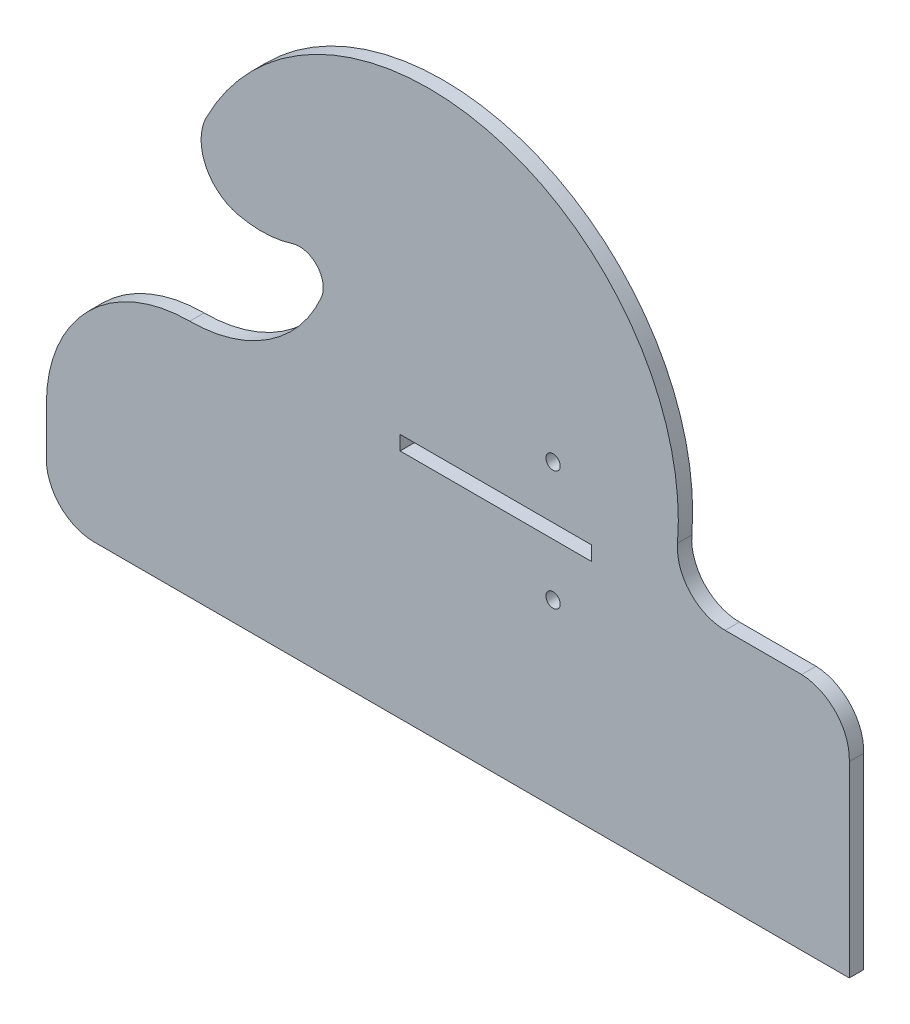
ISO-10303-21;
HEADER;
FILE_DESCRIPTION(('STEP AP214'),'2;1');
FILE_NAME('part.step','',(''),(''),'','','');
FILE_SCHEMA(('AUTOMOTIVE_DESIGN { 1 0 10303 214 1 1 1 1 }'));
ENDSEC;
DATA;
#1=APPLICATION_CONTEXT('core data for automotive mechanical design processes');
#2=APPLICATION_PROTOCOL_DEFINITION('international standard','automotive_design',2000,#1);
#3=PRODUCT_CONTEXT('',#1,'mechanical');
#4=PRODUCT('Part','Part','',(#3));
#5=PRODUCT_RELATED_PRODUCT_CATEGORY('part','',(#4));
#6=PRODUCT_DEFINITION_FORMATION('','',#4);
#7=PRODUCT_DEFINITION_CONTEXT('part definition',#1,'design');
#8=PRODUCT_DEFINITION('design','',#6,#7);
#9=PRODUCT_DEFINITION_SHAPE('','',#8);
#10=(LENGTH_UNIT() NAMED_UNIT(*) SI_UNIT(.MILLI.,.METRE.));
#11=(NAMED_UNIT(*) PLANE_ANGLE_UNIT() SI_UNIT($,.RADIAN.));
#12=(NAMED_UNIT(*) SI_UNIT($,.STERADIAN.) SOLID_ANGLE_UNIT());
#13=UNCERTAINTY_MEASURE_WITH_UNIT(LENGTH_MEASURE(1.E-05),#10,'distance_accuracy_value','');
#14=(GEOMETRIC_REPRESENTATION_CONTEXT(3) GLOBAL_UNCERTAINTY_ASSIGNED_CONTEXT((#13)) GLOBAL_UNIT_ASSIGNED_CONTEXT((#10,
#11,#12)) REPRESENTATION_CONTEXT('',''));
#15=CARTESIAN_POINT('',(0.,0.,0.));
#16=DIRECTION('',(0.,0.,1.));
#17=DIRECTION('',(1.,0.,0.));
#18=AXIS2_PLACEMENT_3D('',#15,#16,#17);
#19=CARTESIAN_POINT('',(-3.69672250453785,-39.0229332465025,3.));
#20=DIRECTION('',(0.,0.,-1.));
#21=DIRECTION('',(-1.,0.,0.));
#22=AXIS2_PLACEMENT_3D('',#19,#20,#21);
#23=CYLINDRICAL_SURFACE('',#22,30.);
#24=CARTESIAN_POINT('',(-3.69672250453785,-39.0229332465025,0.));
#25=DIRECTION('',(0.,0.,1.));
#26=DIRECTION('',(1.,0.,0.));
#27=AXIS2_PLACEMENT_3D('',#24,#25,#26);
#28=CIRCLE('',#27,30.);
#29=CARTESIAN_POINT('',(-3.69672250453788,-9.02293324650248,0.));
#30=VERTEX_POINT('',#29);
#31=CARTESIAN_POINT('',(-33.6967225045379,-39.0229332465025,0.));
#32=VERTEX_POINT('',#31);
#33=EDGE_CURVE('E194',#30,#32,#28,.T.);
#34=ORIENTED_EDGE('',*,*,#33,.T.);
#35=DIRECTION('',(0.,0.,-1.));
#36=VECTOR('',#35,1.);
#37=CARTESIAN_POINT('',(-33.6967225045379,-39.0229332465025,3.));
#38=LINE('',#37,#36);
#39=CARTESIAN_POINT('',(-33.6967225045379,-39.0229332465025,3.));
#40=VERTEX_POINT('',#39);
#41=EDGE_CURVE('E11',#40,#32,#38,.T.);
#42=ORIENTED_EDGE('',*,*,#41,.F.);
#43=CARTESIAN_POINT('',(-3.69672250453785,-39.0229332465025,3.));
#44=DIRECTION('',(0.,0.,1.));
#45=DIRECTION('',(1.,0.,0.));
#46=AXIS2_PLACEMENT_3D('',#43,#44,#45);
#47=CIRCLE('',#46,30.);
#48=CARTESIAN_POINT('',(-3.69672250453788,-9.02293324650248,3.));
#49=VERTEX_POINT('',#48);
#50=EDGE_CURVE('E198',#49,#40,#47,.T.);
#51=ORIENTED_EDGE('',*,*,#50,.F.);
#52=DIRECTION('',(0.,0.,-1.));
#53=VECTOR('',#52,1.);
#54=CARTESIAN_POINT('',(-3.69672250453788,-9.02293324650248,3.));
#55=LINE('',#54,#53);
#56=EDGE_CURVE('E228',#49,#30,#55,.T.);
#57=ORIENTED_EDGE('',*,*,#56,.T.);
#58=EDGE_LOOP('',(#34,#42,#51,#57));
#59=FACE_BOUND('',#58,.T.);
#60=ADVANCED_FACE('F33',(#59),#23,.T.);
#61=CARTESIAN_POINT('',(-33.6967225045379,-39.0229332465025,3.));
#62=DIRECTION('',(0.999999999834086,1.82161160664153E-05,0.));
#63=DIRECTION('',(-1.82161160664153E-05,0.999999999834087,0.));
#64=AXIS2_PLACEMENT_3D('',#61,#62,#63);
#65=PLANE('',#64);
#66=DIRECTION('',(1.82161160664153E-05,-0.999999999834086,0.));
#67=VECTOR('',#66,1.);
#68=CARTESIAN_POINT('',(-33.6967225045379,-39.0229332465025,0.));
#69=LINE('',#68,#67);
#70=CARTESIAN_POINT('',(-33.6965402836484,-49.0262121460669,0.));
#71=VERTEX_POINT('',#70);
#72=EDGE_CURVE('E231',#32,#71,#69,.T.);
#73=ORIENTED_EDGE('',*,*,#72,.T.);
#74=DIRECTION('',(0.,0.,-1.));
#75=VECTOR('',#74,1.);
#76=CARTESIAN_POINT('',(-33.6965402836484,-49.0262121460669,3.));
#77=LINE('',#76,#75);
#78=CARTESIAN_POINT('',(-33.6965402836484,-49.0262121460669,3.));
#79=VERTEX_POINT('',#78);
#80=EDGE_CURVE('E40',#79,#71,#77,.T.);
#81=ORIENTED_EDGE('',*,*,#80,.F.);
#82=DIRECTION('',(1.82161160664153E-05,-0.999999999834086,0.));
#83=VECTOR('',#82,1.);
#84=CARTESIAN_POINT('',(-33.6967225045379,-39.0229332465025,3.));
#85=LINE('',#84,#83);
#86=EDGE_CURVE('E201',#40,#79,#85,.T.);
#87=ORIENTED_EDGE('',*,*,#86,.F.);
#88=ORIENTED_EDGE('',*,*,#41,.T.);
#89=EDGE_LOOP('',(#73,#81,#87,#88));
#90=FACE_BOUND('',#89,.T.);
#91=ADVANCED_FACE('F316',(#90),#65,.F.);
#92=CARTESIAN_POINT('',(-23.6965402853075,-49.0260299849063,3.));
#93=DIRECTION('',(0.,0.,-1.));
#94=DIRECTION('',(-1.,0.,0.));
#95=AXIS2_PLACEMENT_3D('',#92,#93,#94);
#96=CYLINDRICAL_SURFACE('',#95,10.);
#97=CARTESIAN_POINT('',(-23.6965402853075,-49.0260299849063,0.));
#98=DIRECTION('',(0.,0.,1.));
#99=DIRECTION('',(-1.,0.,0.));
#100=AXIS2_PLACEMENT_3D('',#97,#98,#99);
#101=CIRCLE('',#100,10.);
#102=CARTESIAN_POINT('',(-23.6965402853074,-59.0260299849063,0.));
#103=VERTEX_POINT('',#102);
#104=EDGE_CURVE('E233',#71,#103,#101,.T.);
#105=ORIENTED_EDGE('',*,*,#104,.T.);
#106=DIRECTION('',(0.,0.,-1.));
#107=VECTOR('',#106,1.);
#108=CARTESIAN_POINT('',(-23.6965402853074,-59.0260299849063,3.));
#109=LINE('',#108,#107);
#110=CARTESIAN_POINT('',(-23.6965402853074,-59.0260299849063,3.));
#111=VERTEX_POINT('',#110);
#112=EDGE_CURVE('E288',#111,#103,#109,.T.);
#113=ORIENTED_EDGE('',*,*,#112,.F.);
#114=CARTESIAN_POINT('',(-23.6965402853075,-49.0260299849063,3.));
#115=DIRECTION('',(0.,0.,1.));
#116=DIRECTION('',(-1.,0.,0.));
#117=AXIS2_PLACEMENT_3D('',#114,#115,#116);
#118=CIRCLE('',#117,10.);
#119=EDGE_CURVE('E204',#79,#111,#118,.T.);
#120=ORIENTED_EDGE('',*,*,#119,.F.);
#121=ORIENTED_EDGE('',*,*,#80,.T.);
#122=EDGE_LOOP('',(#105,#113,#120,#121));
#123=FACE_BOUND('',#122,.T.);
#124=ADVANCED_FACE('F295',(#123),#96,.T.);
#125=CARTESIAN_POINT('',(-23.6965402853074,-59.0260299849063,3.));
#126=DIRECTION('',(0.,1.,0.));
#127=DIRECTION('',(0.,0.,1.));
#128=AXIS2_PLACEMENT_3D('',#125,#126,#127);
#129=PLANE('',#128);
#130=DIRECTION('',(1.,0.,0.));
#131=VECTOR('',#130,1.);
#132=CARTESIAN_POINT('',(-23.6965402853074,-59.0260299849063,0.));
#133=LINE('',#132,#131);
#134=CARTESIAN_POINT('',(126.303641817783,-59.0260299849063,0.));
#135=VERTEX_POINT('',#134);
#136=EDGE_CURVE('E235',#103,#135,#133,.T.);
#137=ORIENTED_EDGE('',*,*,#136,.T.);
#138=DIRECTION('',(0.,0.,-1.));
#139=VECTOR('',#138,1.);
#140=CARTESIAN_POINT('',(126.303641817783,-59.0260299849063,3.));
#141=LINE('',#140,#139);
#142=CARTESIAN_POINT('',(126.303641817783,-59.0260299849063,3.));
#143=VERTEX_POINT('',#142);
#144=EDGE_CURVE('E285',#143,#135,#141,.T.);
#145=ORIENTED_EDGE('',*,*,#144,.F.);
#146=DIRECTION('',(1.,0.,0.));
#147=VECTOR('',#146,1.);
#148=CARTESIAN_POINT('',(-23.6965402853074,-59.0260299849063,3.));
#149=LINE('',#148,#147);
#150=EDGE_CURVE('E206',#111,#143,#149,.T.);
#151=ORIENTED_EDGE('',*,*,#150,.F.);
#152=ORIENTED_EDGE('',*,*,#112,.T.);
#153=EDGE_LOOP('',(#137,#145,#151,#152));
#154=FACE_BOUND('',#153,.T.);
#155=ADVANCED_FACE('F304',(#154),#129,.F.);
#156=CARTESIAN_POINT('',(134.271164489575,-59.0229332451747,3.));
#157=DIRECTION('',(-0.000388670308860665,0.999999924467692,0.));
#158=DIRECTION('',(-0.999999924467693,-0.000388670308860665,0.));
#159=AXIS2_PLACEMENT_3D('',#156,#157,#158);
#160=PLANE('',#159);
#161=DIRECTION('',(0.999999924467693,0.000388670308860665,0.));
#162=VECTOR('',#161,1.);
#163=CARTESIAN_POINT('',(134.271164489575,-59.0229332451747,0.));
#164=LINE('',#163,#162);
#165=CARTESIAN_POINT('',(134.271164489575,-59.0229332451747,0.));
#166=VERTEX_POINT('',#165);
#167=EDGE_CURVE('E237',#135,#166,#164,.T.);
#168=ORIENTED_EDGE('',*,*,#167,.T.);
#169=DIRECTION('',(0.,0.,-1.));
#170=VECTOR('',#169,1.);
#171=CARTESIAN_POINT('',(134.271164489575,-59.0229332451747,3.));
#172=LINE('',#171,#170);
#173=CARTESIAN_POINT('',(134.271164489575,-59.0229332451747,3.));
#174=VERTEX_POINT('',#173);
#175=EDGE_CURVE('E282',#174,#166,#172,.T.);
#176=ORIENTED_EDGE('',*,*,#175,.F.);
#177=DIRECTION('',(0.999999924467693,0.000388670308860665,0.));
#178=VECTOR('',#177,1.);
#179=CARTESIAN_POINT('',(134.271164489575,-59.0229332451747,3.));
#180=LINE('',#179,#178);
#181=EDGE_CURVE('E208',#143,#174,#180,.T.);
#182=ORIENTED_EDGE('',*,*,#181,.F.);
#183=ORIENTED_EDGE('',*,*,#144,.T.);
#184=EDGE_LOOP('',(#168,#176,#182,#183));
#185=FACE_BOUND('',#184,.T.);
#186=ADVANCED_FACE('F308',(#185),#160,.F.);
#187=CARTESIAN_POINT('',(134.271164489575,-19.8229332465025,3.));
#188=DIRECTION('',(-1.,0.,0.));
#189=DIRECTION('',(0.,0.,1.));
#190=AXIS2_PLACEMENT_3D('',#187,#188,#189);
#191=PLANE('',#190);
#192=DIRECTION('',(0.,1.,0.));
#193=VECTOR('',#192,1.);
#194=CARTESIAN_POINT('',(134.271164489575,-19.8229332465025,0.));
#195=LINE('',#194,#193);
#196=CARTESIAN_POINT('',(134.271164489575,-19.8229332465025,0.));
#197=VERTEX_POINT('',#196);
#198=EDGE_CURVE('E239',#166,#197,#195,.T.);
#199=ORIENTED_EDGE('',*,*,#198,.T.);
#200=DIRECTION('',(0.,0.,-1.));
#201=VECTOR('',#200,1.);
#202=CARTESIAN_POINT('',(134.271164489575,-19.8229332465025,3.));
#203=LINE('',#202,#201);
#204=CARTESIAN_POINT('',(134.271164489575,-19.8229332465025,3.));
#205=VERTEX_POINT('',#204);
#206=EDGE_CURVE('E279',#205,#197,#203,.T.);
#207=ORIENTED_EDGE('',*,*,#206,.F.);
#208=DIRECTION('',(0.,1.,0.));
#209=VECTOR('',#208,1.);
#210=CARTESIAN_POINT('',(134.271164489575,-19.8229332465025,3.));
#211=LINE('',#210,#209);
#212=EDGE_CURVE('E210',#174,#205,#211,.T.);
#213=ORIENTED_EDGE('',*,*,#212,.F.);
#214=ORIENTED_EDGE('',*,*,#175,.T.);
#215=EDGE_LOOP('',(#199,#207,#213,#214));
#216=FACE_BOUND('',#215,.T.);
#217=ADVANCED_FACE('F359',(#216),#191,.F.);
#218=CARTESIAN_POINT('',(123.886168263713,-19.4078388128588,3.));
#219=DIRECTION('',(0.,0.,-1.));
#220=DIRECTION('',(-1.,0.,0.));
#221=AXIS2_PLACEMENT_3D('',#218,#219,#220);
#222=CYLINDRICAL_SURFACE('',#221,10.3932886999255);
#223=CARTESIAN_POINT('',(123.886168263713,-19.4078388128588,0.));
#224=DIRECTION('',(0.,0.,1.));
#225=DIRECTION('',(-1.,0.,0.));
#226=AXIS2_PLACEMENT_3D('',#223,#224,#225);
#227=CIRCLE('',#226,10.3932886999255);
#228=CARTESIAN_POINT('',(124.303524679575,-9.02293324650249,0.));
#229=VERTEX_POINT('',#228);
#230=EDGE_CURVE('E241',#197,#229,#227,.T.);
#231=ORIENTED_EDGE('',*,*,#230,.T.);
#232=DIRECTION('',(0.,0.,-1.));
#233=VECTOR('',#232,1.);
#234=CARTESIAN_POINT('',(124.303524679575,-9.02293324650249,3.));
#235=LINE('',#234,#233);
#236=CARTESIAN_POINT('',(124.303524679575,-9.02293324650249,3.));
#237=VERTEX_POINT('',#236);
#238=EDGE_CURVE('E276',#237,#229,#235,.T.);
#239=ORIENTED_EDGE('',*,*,#238,.F.);
#240=CARTESIAN_POINT('',(123.886168263713,-19.4078388128588,3.));
#241=DIRECTION('',(0.,0.,1.));
#242=DIRECTION('',(-1.,0.,0.));
#243=AXIS2_PLACEMENT_3D('',#240,#241,#242);
#244=CIRCLE('',#243,10.3932886999255);
#245=EDGE_CURVE('E212',#205,#237,#244,.T.);
#246=ORIENTED_EDGE('',*,*,#245,.F.);
#247=ORIENTED_EDGE('',*,*,#206,.T.);
#248=EDGE_LOOP('',(#231,#239,#246,#247));
#249=FACE_BOUND('',#248,.T.);
#250=ADVANCED_FACE('F357',(#249),#222,.T.);
#251=CARTESIAN_POINT('',(108.303524679575,-9.0229332465025,3.));
#252=DIRECTION('',(0.,-1.,0.));
#253=DIRECTION('',(1.,0.,0.));
#254=AXIS2_PLACEMENT_3D('',#251,#252,#253);
#255=PLANE('',#254);
#256=DIRECTION('',(-1.,0.,0.));
#257=VECTOR('',#256,1.);
#258=CARTESIAN_POINT('',(108.303524679575,-9.0229332465025,0.));
#259=LINE('',#258,#257);
#260=CARTESIAN_POINT('',(108.303524679575,-9.02293324650249,0.));
#261=VERTEX_POINT('',#260);
#262=EDGE_CURVE('E243',#229,#261,#259,.T.);
#263=ORIENTED_EDGE('',*,*,#262,.T.);
#264=DIRECTION('',(0.,0.,-1.));
#265=VECTOR('',#264,1.);
#266=CARTESIAN_POINT('',(108.303524679575,-9.02293324650249,3.));
#267=LINE('',#266,#265);
#268=CARTESIAN_POINT('',(108.303524679575,-9.02293324650249,3.));
#269=VERTEX_POINT('',#268);
#270=EDGE_CURVE('E273',#269,#261,#267,.T.);
#271=ORIENTED_EDGE('',*,*,#270,.F.);
#272=DIRECTION('',(-1.,0.,0.));
#273=VECTOR('',#272,1.);
#274=CARTESIAN_POINT('',(108.303524679575,-9.0229332465025,3.));
#275=LINE('',#274,#273);
#276=EDGE_CURVE('E214',#237,#269,#275,.T.);
#277=ORIENTED_EDGE('',*,*,#276,.F.);
#278=ORIENTED_EDGE('',*,*,#238,.T.);
#279=EDGE_LOOP('',(#263,#271,#277,#278));
#280=FACE_BOUND('',#279,.T.);
#281=ADVANCED_FACE('F352',(#280),#255,.F.);
#282=CARTESIAN_POINT('',(108.303524679575,0.977066753497506,3.));
#283=DIRECTION('',(0.,0.,-1.));
#284=DIRECTION('',(-1.,0.,0.));
#285=AXIS2_PLACEMENT_3D('',#282,#283,#284);
#286=CYLINDRICAL_SURFACE('',#285,10.);
#287=CARTESIAN_POINT('',(108.303524679575,0.977066753497506,0.));
#288=DIRECTION('',(0.,0.,-1.));
#289=DIRECTION('',(-1.,0.,0.));
#290=AXIS2_PLACEMENT_3D('',#287,#288,#289);
#291=CIRCLE('',#290,10.);
#292=CARTESIAN_POINT('',(98.335884872677,1.78090546863187,0.));
#293=VERTEX_POINT('',#292);
#294=EDGE_CURVE('E245',#261,#293,#291,.T.);
#295=ORIENTED_EDGE('',*,*,#294,.T.);
#296=DIRECTION('',(0.,0.,-1.));
#297=VECTOR('',#296,1.);
#298=CARTESIAN_POINT('',(98.335884872677,1.78090546863187,3.));
#299=LINE('',#298,#297);
#300=CARTESIAN_POINT('',(98.335884872677,1.78090546863187,3.));
#301=VERTEX_POINT('',#300);
#302=EDGE_CURVE('E270',#301,#293,#299,.T.);
#303=ORIENTED_EDGE('',*,*,#302,.F.);
#304=CARTESIAN_POINT('',(108.303524679575,0.977066753497506,3.));
#305=DIRECTION('',(0.,0.,-1.));
#306=DIRECTION('',(-1.,0.,0.));
#307=AXIS2_PLACEMENT_3D('',#304,#305,#306);
#308=CIRCLE('',#307,10.);
#309=EDGE_CURVE('E216',#269,#301,#308,.T.);
#310=ORIENTED_EDGE('',*,*,#309,.F.);
#311=ORIENTED_EDGE('',*,*,#270,.T.);
#312=EDGE_LOOP('',(#295,#303,#310,#311));
#313=FACE_BOUND('',#312,.T.);
#314=ADVANCED_FACE('F347',(#313),#286,.F.);
#315=CARTESIAN_POINT('',(46.3032774954621,5.97706675349758,3.));
#316=DIRECTION('',(0.,0.,-1.));
#317=DIRECTION('',(-1.,0.,0.));
#318=AXIS2_PLACEMENT_3D('',#315,#316,#317);
#319=CYLINDRICAL_SURFACE('',#318,52.2015325445528);
#320=CARTESIAN_POINT('',(46.3032774954621,5.97706675349758,0.));
#321=DIRECTION('',(0.,0.,1.));
#322=DIRECTION('',(-1.,0.,0.));
#323=AXIS2_PLACEMENT_3D('',#320,#321,#322);
#324=CIRCLE('',#323,52.2015325445528);
#325=CARTESIAN_POINT('',(-0.245391501906007,29.603776523871,0.));
#326=VERTEX_POINT('',#325);
#327=EDGE_CURVE('E247',#293,#326,#324,.T.);
#328=ORIENTED_EDGE('',*,*,#327,.T.);
#329=DIRECTION('',(0.,0.,-1.));
#330=VECTOR('',#329,1.);
#331=CARTESIAN_POINT('',(-0.245391501906007,29.603776523871,3.));
#332=LINE('',#331,#330);
#333=CARTESIAN_POINT('',(-0.245391501906007,29.603776523871,3.));
#334=VERTEX_POINT('',#333);
#335=EDGE_CURVE('E267',#334,#326,#332,.T.);
#336=ORIENTED_EDGE('',*,*,#335,.F.);
#337=CARTESIAN_POINT('',(46.3032774954621,5.97706675349758,3.));
#338=DIRECTION('',(0.,0.,1.));
#339=DIRECTION('',(-1.,0.,0.));
#340=AXIS2_PLACEMENT_3D('',#337,#338,#339);
#341=CIRCLE('',#340,52.2015325445528);
#342=EDGE_CURVE('E218',#301,#334,#341,.T.);
#343=ORIENTED_EDGE('',*,*,#342,.F.);
#344=ORIENTED_EDGE('',*,*,#302,.T.);
#345=EDGE_LOOP('',(#328,#336,#343,#344));
#346=FACE_BOUND('',#345,.T.);
#347=ADVANCED_FACE('F343',(#346),#319,.T.);
#348=CARTESIAN_POINT('',(8.67171623964163,25.0777197936,3.));
#349=DIRECTION('',(0.,0.,-1.));
#350=DIRECTION('',(-1.,0.,0.));
#351=AXIS2_PLACEMENT_3D('',#348,#349,#350);
#352=CYLINDRICAL_SURFACE('',#351,10.);
#353=CARTESIAN_POINT('',(8.67171623964163,25.0777197936,0.));
#354=DIRECTION('',(0.,0.,1.));
#355=DIRECTION('',(1.,0.,0.));
#356=AXIS2_PLACEMENT_3D('',#353,#354,#355);
#357=CIRCLE('',#356,10.);
#358=CARTESIAN_POINT('',(6.32530271980205,15.3568996844778,0.));
#359=VERTEX_POINT('',#358);
#360=EDGE_CURVE('E249',#326,#359,#357,.T.);
#361=ORIENTED_EDGE('',*,*,#360,.T.);
#362=DIRECTION('',(0.,0.,-1.));
#363=VECTOR('',#362,1.);
#364=CARTESIAN_POINT('',(6.32530271980205,15.3568996844778,3.));
#365=LINE('',#364,#363);
#366=CARTESIAN_POINT('',(6.32530271980205,15.3568996844778,3.));
#367=VERTEX_POINT('',#366);
#368=EDGE_CURVE('E264',#367,#359,#365,.T.);
#369=ORIENTED_EDGE('',*,*,#368,.F.);
#370=CARTESIAN_POINT('',(8.67171623964163,25.0777197936,3.));
#371=DIRECTION('',(0.,0.,1.));
#372=DIRECTION('',(1.,0.,0.));
#373=AXIS2_PLACEMENT_3D('',#370,#371,#372);
#374=CIRCLE('',#373,10.);
#375=EDGE_CURVE('E220',#334,#367,#374,.T.);
#376=ORIENTED_EDGE('',*,*,#375,.F.);
#377=ORIENTED_EDGE('',*,*,#335,.T.);
#378=EDGE_LOOP('',(#361,#369,#376,#377));
#379=FACE_BOUND('',#378,.T.);
#380=ADVANCED_FACE('F338',(#379),#352,.T.);
#381=CARTESIAN_POINT('',(11.3031666132172,35.9794025069521,3.));
#382=DIRECTION('',(0.,0.,-1.));
#383=DIRECTION('',(-1.,0.,0.));
#384=AXIS2_PLACEMENT_3D('',#381,#382,#383);
#385=CYLINDRICAL_SURFACE('',#384,21.2147767276567);
#386=CARTESIAN_POINT('',(11.3031666132172,35.9794025069521,0.));
#387=DIRECTION('',(0.,0.,1.));
#388=DIRECTION('',(1.,0.,0.));
#389=AXIS2_PLACEMENT_3D('',#386,#387,#388);
#390=CIRCLE('',#389,21.2147767276567);
#391=CARTESIAN_POINT('',(17.7111350484634,15.7555380855016,0.));
#392=VERTEX_POINT('',#391);
#393=EDGE_CURVE('E251',#359,#392,#390,.T.);
#394=ORIENTED_EDGE('',*,*,#393,.T.);
#395=DIRECTION('',(0.,0.,-1.));
#396=VECTOR('',#395,1.);
#397=CARTESIAN_POINT('',(17.7111350484634,15.7555380855016,3.));
#398=LINE('',#397,#396);
#399=CARTESIAN_POINT('',(17.7111350484634,15.7555380855016,3.));
#400=VERTEX_POINT('',#399);
#401=EDGE_CURVE('E261',#400,#392,#398,.T.);
#402=ORIENTED_EDGE('',*,*,#401,.F.);
#403=CARTESIAN_POINT('',(11.3031666132172,35.9794025069521,3.));
#404=DIRECTION('',(0.,0.,1.));
#405=DIRECTION('',(1.,0.,0.));
#406=AXIS2_PLACEMENT_3D('',#403,#404,#405);
#407=CIRCLE('',#406,21.2147767276567);
#408=EDGE_CURVE('E222',#367,#400,#407,.T.);
#409=ORIENTED_EDGE('',*,*,#408,.F.);
#410=ORIENTED_EDGE('',*,*,#368,.T.);
#411=EDGE_LOOP('',(#394,#402,#409,#410));
#412=FACE_BOUND('',#411,.T.);
#413=ADVANCED_FACE('F332',(#412),#385,.T.);
#414=CARTESIAN_POINT('',(19.2213956836584,10.989081035052,3.));
#415=DIRECTION('',(0.,0.,-1.));
#416=DIRECTION('',(-1.,0.,0.));
#417=AXIS2_PLACEMENT_3D('',#414,#415,#416);
#418=CYLINDRICAL_SURFACE('',#417,5.);
#419=CARTESIAN_POINT('',(19.2213956836584,10.989081035052,0.));
#420=DIRECTION('',(0.,0.,-1.));
#421=DIRECTION('',(-1.,0.,0.));
#422=AXIS2_PLACEMENT_3D('',#419,#420,#421);
#423=CIRCLE('',#422,5.);
#424=CARTESIAN_POINT('',(23.8050193212976,8.99148389136287,0.));
#425=VERTEX_POINT('',#424);
#426=EDGE_CURVE('E253',#392,#425,#423,.T.);
#427=ORIENTED_EDGE('',*,*,#426,.T.);
#428=DIRECTION('',(0.,0.,-1.));
#429=VECTOR('',#428,1.);
#430=CARTESIAN_POINT('',(23.8050193212976,8.99148389136287,3.));
#431=LINE('',#430,#429);
#432=CARTESIAN_POINT('',(23.8050193212976,8.99148389136287,3.));
#433=VERTEX_POINT('',#432);
#434=EDGE_CURVE('E258',#433,#425,#431,.T.);
#435=ORIENTED_EDGE('',*,*,#434,.F.);
#436=CARTESIAN_POINT('',(19.2213956836584,10.989081035052,3.));
#437=DIRECTION('',(0.,0.,-1.));
#438=DIRECTION('',(-1.,0.,0.));
#439=AXIS2_PLACEMENT_3D('',#436,#437,#438);
#440=CIRCLE('',#439,5.);
#441=EDGE_CURVE('E224',#400,#433,#440,.T.);
#442=ORIENTED_EDGE('',*,*,#441,.F.);
#443=ORIENTED_EDGE('',*,*,#401,.T.);
#444=EDGE_LOOP('',(#427,#435,#442,#443));
#445=FACE_BOUND('',#444,.T.);
#446=ADVANCED_FACE('F328',(#445),#418,.F.);
#447=CARTESIAN_POINT('',(-3.69672250453787,20.9770667534977,3.));
#448=DIRECTION('',(0.,0.,-1.));
#449=DIRECTION('',(-1.,0.,0.));
#450=AXIS2_PLACEMENT_3D('',#447,#448,#449);
#451=CYLINDRICAL_SURFACE('',#450,30.0000000000001);
#452=CARTESIAN_POINT('',(-3.69672250453787,20.9770667534977,0.));
#453=DIRECTION('',(0.,0.,-1.));
#454=DIRECTION('',(1.,0.,0.));
#455=AXIS2_PLACEMENT_3D('',#452,#453,#454);
#456=CIRCLE('',#455,30.0000000000001);
#457=EDGE_CURVE('E202',#425,#30,#456,.T.);
#458=ORIENTED_EDGE('',*,*,#457,.T.);
#459=ORIENTED_EDGE('',*,*,#56,.F.);
#460=CARTESIAN_POINT('',(-3.69672250453787,20.9770667534977,3.));
#461=DIRECTION('',(0.,0.,-1.));
#462=DIRECTION('',(1.,0.,0.));
#463=AXIS2_PLACEMENT_3D('',#460,#461,#462);
#464=CIRCLE('',#463,30.0000000000001);
#465=EDGE_CURVE('E226',#433,#49,#464,.T.);
#466=ORIENTED_EDGE('',*,*,#465,.F.);
#467=ORIENTED_EDGE('',*,*,#434,.T.);
#468=EDGE_LOOP('',(#458,#459,#466,#467));
#469=FACE_BOUND('',#468,.T.);
#470=ADVANCED_FACE('F323',(#469),#451,.F.);
#471=CARTESIAN_POINT('',(-3.69672250453785,-39.0229332465025,3.));
#472=DIRECTION('',(0.,0.,1.));
#473=DIRECTION('',(1.,0.,0.));
#474=AXIS2_PLACEMENT_3D('',#471,#472,#473);
#475=PLANE('',#474);
#476=CARTESIAN_POINT('',(72.3035246795747,-21.5229332465025,3.));
#477=DIRECTION('',(0.,0.,1.));
#478=DIRECTION('',(1.,0.,0.));
#479=AXIS2_PLACEMENT_3D('',#476,#477,#478);
#480=CIRCLE('',#479,1.5);
#481=CARTESIAN_POINT('',(73.8035246795747,-21.5229332465025,3.));
#482=VERTEX_POINT('',#481);
#483=EDGE_CURVE('E531',#482,#482,#480,.T.);
#484=ORIENTED_EDGE('',*,*,#483,.F.);
#485=EDGE_LOOP('',(#484));
#486=FACE_BOUND('',#485,.T.);
#487=CARTESIAN_POINT('',(72.3035246795747,3.47706675349751,3.));
#488=DIRECTION('',(0.,0.,1.));
#489=DIRECTION('',(1.,0.,0.));
#490=AXIS2_PLACEMENT_3D('',#487,#488,#489);
#491=CIRCLE('',#490,1.5);
#492=CARTESIAN_POINT('',(73.8035246795747,3.47706675349751,3.));
#493=VERTEX_POINT('',#492);
#494=EDGE_CURVE('E181',#493,#493,#491,.T.);
#495=ORIENTED_EDGE('',*,*,#494,.F.);
#496=EDGE_LOOP('',(#495));
#497=FACE_BOUND('',#496,.T.);
#498=DIRECTION('',(0.,-1.,0.));
#499=VECTOR('',#498,1.);
#500=CARTESIAN_POINT('',(40.3032774954621,-10.5229332465025,3.));
#501=LINE('',#500,#499);
#502=CARTESIAN_POINT('',(40.3032774954621,-7.52293324650249,3.));
#503=VERTEX_POINT('',#502);
#504=CARTESIAN_POINT('',(40.3032774954621,-10.5229332465025,3.));
#505=VERTEX_POINT('',#504);
#506=EDGE_CURVE('E47',#503,#505,#501,.T.);
#507=ORIENTED_EDGE('',*,*,#506,.F.);
#508=DIRECTION('',(-1.,0.,0.));
#509=VECTOR('',#508,1.);
#510=CARTESIAN_POINT('',(40.3032774954621,-7.52293324650249,3.));
#511=LINE('',#510,#509);
#512=CARTESIAN_POINT('',(80.3035246795747,-7.52293324650249,3.));
#513=VERTEX_POINT('',#512);
#514=EDGE_CURVE('E175',#513,#503,#511,.T.);
#515=ORIENTED_EDGE('',*,*,#514,.F.);
#516=DIRECTION('',(0.,1.,0.));
#517=VECTOR('',#516,1.);
#518=CARTESIAN_POINT('',(80.3035246795747,-10.5229332465025,3.));
#519=LINE('',#518,#517);
#520=CARTESIAN_POINT('',(80.3035246795747,-10.5229332465025,3.));
#521=VERTEX_POINT('',#520);
#522=EDGE_CURVE('E178',#521,#513,#519,.T.);
#523=ORIENTED_EDGE('',*,*,#522,.F.);
#524=DIRECTION('',(1.,0.,0.));
#525=VECTOR('',#524,1.);
#526=CARTESIAN_POINT('',(40.3032774954621,-10.5229332465025,3.));
#527=LINE('',#526,#525);
#528=EDGE_CURVE('E187',#505,#521,#527,.T.);
#529=ORIENTED_EDGE('',*,*,#528,.F.);
#530=EDGE_LOOP('',(#507,#515,#523,#529));
#531=FACE_BOUND('',#530,.T.);
#532=ORIENTED_EDGE('',*,*,#50,.T.);
#533=ORIENTED_EDGE('',*,*,#86,.T.);
#534=ORIENTED_EDGE('',*,*,#119,.T.);
#535=ORIENTED_EDGE('',*,*,#150,.T.);
#536=ORIENTED_EDGE('',*,*,#181,.T.);
#537=ORIENTED_EDGE('',*,*,#212,.T.);
#538=ORIENTED_EDGE('',*,*,#245,.T.);
#539=ORIENTED_EDGE('',*,*,#276,.T.);
#540=ORIENTED_EDGE('',*,*,#309,.T.);
#541=ORIENTED_EDGE('',*,*,#342,.T.);
#542=ORIENTED_EDGE('',*,*,#375,.T.);
#543=ORIENTED_EDGE('',*,*,#408,.T.);
#544=ORIENTED_EDGE('',*,*,#441,.T.);
#545=ORIENTED_EDGE('',*,*,#465,.T.);
#546=EDGE_LOOP('',(#532,#533,#534,#535,#536,#537,#538,#539,#540,#541,#542,#543,#544,#545));
#547=FACE_BOUND('',#546,.T.);
#548=ADVANCED_FACE('F312',(#486,#497,#531,#547),#475,.T.);
#549=CARTESIAN_POINT('',(-3.69672250453785,-39.0229332465025,0.));
#550=DIRECTION('',(0.,0.,1.));
#551=DIRECTION('',(1.,0.,0.));
#552=AXIS2_PLACEMENT_3D('',#549,#550,#551);
#553=PLANE('',#552);
#554=CARTESIAN_POINT('',(72.3035246795747,-21.5229332465025,0.));
#555=DIRECTION('',(0.,0.,1.));
#556=DIRECTION('',(1.,0.,0.));
#557=AXIS2_PLACEMENT_3D('',#554,#555,#556);
#558=CIRCLE('',#557,1.5);
#559=CARTESIAN_POINT('',(73.8035246795747,-21.5229332465025,0.));
#560=VERTEX_POINT('',#559);
#561=EDGE_CURVE('E528',#560,#560,#558,.T.);
#562=ORIENTED_EDGE('',*,*,#561,.T.);
#563=EDGE_LOOP('',(#562));
#564=FACE_BOUND('',#563,.T.);
#565=CARTESIAN_POINT('',(72.3035246795747,3.47706675349751,0.));
#566=DIRECTION('',(0.,0.,1.));
#567=DIRECTION('',(1.,0.,0.));
#568=AXIS2_PLACEMENT_3D('',#565,#566,#567);
#569=CIRCLE('',#568,1.5);
#570=CARTESIAN_POINT('',(73.8035246795747,3.47706675349751,0.));
#571=VERTEX_POINT('',#570);
#572=EDGE_CURVE('E188',#571,#571,#569,.T.);
#573=ORIENTED_EDGE('',*,*,#572,.T.);
#574=EDGE_LOOP('',(#573));
#575=FACE_BOUND('',#574,.T.);
#576=DIRECTION('',(-1.,0.,0.));
#577=VECTOR('',#576,1.);
#578=CARTESIAN_POINT('',(40.3032774954621,-7.52293324650249,0.));
#579=LINE('',#578,#577);
#580=CARTESIAN_POINT('',(80.3035246795747,-7.52293324650249,0.));
#581=VERTEX_POINT('',#580);
#582=CARTESIAN_POINT('',(40.3032774954621,-7.52293324650249,0.));
#583=VERTEX_POINT('',#582);
#584=EDGE_CURVE('E165',#581,#583,#579,.T.);
#585=ORIENTED_EDGE('',*,*,#584,.T.);
#586=DIRECTION('',(0.,-1.,0.));
#587=VECTOR('',#586,1.);
#588=CARTESIAN_POINT('',(40.3032774954621,-10.5229332465025,0.));
#589=LINE('',#588,#587);
#590=CARTESIAN_POINT('',(40.3032774954621,-10.5229332465025,0.));
#591=VERTEX_POINT('',#590);
#592=EDGE_CURVE('E159',#583,#591,#589,.T.);
#593=ORIENTED_EDGE('',*,*,#592,.T.);
#594=DIRECTION('',(1.,0.,0.));
#595=VECTOR('',#594,1.);
#596=CARTESIAN_POINT('',(40.3032774954621,-10.5229332465025,0.));
#597=LINE('',#596,#595);
#598=CARTESIAN_POINT('',(80.3035246795747,-10.5229332465025,0.));
#599=VERTEX_POINT('',#598);
#600=EDGE_CURVE('E168',#591,#599,#597,.T.);
#601=ORIENTED_EDGE('',*,*,#600,.T.);
#602=DIRECTION('',(0.,1.,0.));
#603=VECTOR('',#602,1.);
#604=CARTESIAN_POINT('',(80.3035246795747,-10.5229332465025,0.));
#605=LINE('',#604,#603);
#606=EDGE_CURVE('E55',#599,#581,#605,.T.);
#607=ORIENTED_EDGE('',*,*,#606,.T.);
#608=EDGE_LOOP('',(#585,#593,#601,#607));
#609=FACE_BOUND('',#608,.T.);
#610=ORIENTED_EDGE('',*,*,#33,.F.);
#611=ORIENTED_EDGE('',*,*,#457,.F.);
#612=ORIENTED_EDGE('',*,*,#426,.F.);
#613=ORIENTED_EDGE('',*,*,#393,.F.);
#614=ORIENTED_EDGE('',*,*,#360,.F.);
#615=ORIENTED_EDGE('',*,*,#327,.F.);
#616=ORIENTED_EDGE('',*,*,#294,.F.);
#617=ORIENTED_EDGE('',*,*,#262,.F.);
#618=ORIENTED_EDGE('',*,*,#230,.F.);
#619=ORIENTED_EDGE('',*,*,#198,.F.);
#620=ORIENTED_EDGE('',*,*,#167,.F.);
#621=ORIENTED_EDGE('',*,*,#136,.F.);
#622=ORIENTED_EDGE('',*,*,#104,.F.);
#623=ORIENTED_EDGE('',*,*,#72,.F.);
#624=EDGE_LOOP('',(#610,#611,#612,#613,#614,#615,#616,#617,#618,#619,#620,#621,#622,#623));
#625=FACE_BOUND('',#624,.T.);
#626=ADVANCED_FACE('F172',(#564,#575,#609,#625),#553,.F.);
#627=CARTESIAN_POINT('',(40.3032774954621,-10.5229332465025,0.));
#628=DIRECTION('',(-1.,0.,0.));
#629=DIRECTION('',(0.,0.,1.));
#630=AXIS2_PLACEMENT_3D('',#627,#628,#629);
#631=PLANE('',#630);
#632=ORIENTED_EDGE('',*,*,#506,.T.);
#633=DIRECTION('',(0.,0.,1.));
#634=VECTOR('',#633,1.);
#635=CARTESIAN_POINT('',(40.3032774954621,-10.5229332465025,0.));
#636=LINE('',#635,#634);
#637=EDGE_CURVE('E155',#591,#505,#636,.T.);
#638=ORIENTED_EDGE('',*,*,#637,.F.);
#639=ORIENTED_EDGE('',*,*,#592,.F.);
#640=DIRECTION('',(0.,0.,1.));
#641=VECTOR('',#640,1.);
#642=CARTESIAN_POINT('',(40.3032774954621,-7.52293324650249,0.));
#643=LINE('',#642,#641);
#644=EDGE_CURVE('E192',#583,#503,#643,.T.);
#645=ORIENTED_EDGE('',*,*,#644,.T.);
#646=EDGE_LOOP('',(#632,#638,#639,#645));
#647=FACE_BOUND('',#646,.T.);
#648=ADVANCED_FACE('F157',(#647),#631,.F.);
#649=CARTESIAN_POINT('',(40.3032774954621,-7.52293324650249,0.));
#650=DIRECTION('',(0.,1.,0.));
#651=DIRECTION('',(-1.,0.,0.));
#652=AXIS2_PLACEMENT_3D('',#649,#650,#651);
#653=PLANE('',#652);
#654=ORIENTED_EDGE('',*,*,#514,.T.);
#655=ORIENTED_EDGE('',*,*,#644,.F.);
#656=ORIENTED_EDGE('',*,*,#584,.F.);
#657=DIRECTION('',(0.,0.,1.));
#658=VECTOR('',#657,1.);
#659=CARTESIAN_POINT('',(80.3035246795747,-7.52293324650249,0.));
#660=LINE('',#659,#658);
#661=EDGE_CURVE('E195',#581,#513,#660,.T.);
#662=ORIENTED_EDGE('',*,*,#661,.T.);
#663=EDGE_LOOP('',(#654,#655,#656,#662));
#664=FACE_BOUND('',#663,.T.);
#665=ADVANCED_FACE('F463',(#664),#653,.F.);
#666=CARTESIAN_POINT('',(80.3035246795747,-10.5229332465025,0.));
#667=DIRECTION('',(1.,0.,0.));
#668=DIRECTION('',(0.,0.,-1.));
#669=AXIS2_PLACEMENT_3D('',#666,#667,#668);
#670=PLANE('',#669);
#671=ORIENTED_EDGE('',*,*,#522,.T.);
#672=ORIENTED_EDGE('',*,*,#661,.F.);
#673=ORIENTED_EDGE('',*,*,#606,.F.);
#674=DIRECTION('',(0.,0.,1.));
#675=VECTOR('',#674,1.);
#676=CARTESIAN_POINT('',(80.3035246795747,-10.5229332465025,0.));
#677=LINE('',#676,#675);
#678=EDGE_CURVE('E164',#599,#521,#677,.T.);
#679=ORIENTED_EDGE('',*,*,#678,.T.);
#680=EDGE_LOOP('',(#671,#672,#673,#679));
#681=FACE_BOUND('',#680,.T.);
#682=ADVANCED_FACE('F474',(#681),#670,.F.);
#683=CARTESIAN_POINT('',(40.3032774954621,-10.5229332465025,0.));
#684=DIRECTION('',(0.,-1.,0.));
#685=DIRECTION('',(1.,0.,0.));
#686=AXIS2_PLACEMENT_3D('',#683,#684,#685);
#687=PLANE('',#686);
#688=ORIENTED_EDGE('',*,*,#528,.T.);
#689=ORIENTED_EDGE('',*,*,#678,.F.);
#690=ORIENTED_EDGE('',*,*,#600,.F.);
#691=ORIENTED_EDGE('',*,*,#637,.T.);
#692=EDGE_LOOP('',(#688,#689,#690,#691));
#693=FACE_BOUND('',#692,.T.);
#694=ADVANCED_FACE('F169',(#693),#687,.F.);
#695=CARTESIAN_POINT('',(72.3035246795747,3.47706675349751,0.));
#696=DIRECTION('',(0.,0.,1.));
#697=DIRECTION('',(1.,0.,0.));
#698=AXIS2_PLACEMENT_3D('',#695,#696,#697);
#699=CYLINDRICAL_SURFACE('',#698,1.5);
#700=ORIENTED_EDGE('',*,*,#572,.F.);
#701=EDGE_LOOP('',(#700));
#702=FACE_BOUND('',#701,.T.);
#703=ORIENTED_EDGE('',*,*,#494,.T.);
#704=EDGE_LOOP('',(#703));
#705=FACE_BOUND('',#704,.T.);
#706=ADVANCED_FACE('F492',(#702,#705),#699,.F.);
#707=CARTESIAN_POINT('',(72.3035246795747,-21.5229332465025,0.));
#708=DIRECTION('',(0.,0.,1.));
#709=DIRECTION('',(1.,0.,0.));
#710=AXIS2_PLACEMENT_3D('',#707,#708,#709);
#711=CYLINDRICAL_SURFACE('',#710,1.5);
#712=ORIENTED_EDGE('',*,*,#561,.F.);
#713=EDGE_LOOP('',(#712));
#714=FACE_BOUND('',#713,.T.);
#715=ORIENTED_EDGE('',*,*,#483,.T.);
#716=EDGE_LOOP('',(#715));
#717=FACE_BOUND('',#716,.T.);
#718=ADVANCED_FACE('F511',(#714,#717),#711,.F.);
#719=CLOSED_SHELL('',(#60,#91,#124,#155,#186,#217,#250,#281,#314,#347,#380,#413,#446,#470,#548,
#626,#648,#665,#682,#694,#706,#718));
#720=MANIFOLD_SOLID_BREP('B2',#719);
#721=ADVANCED_BREP_SHAPE_REPRESENTATION('',(#18,#720),#14);
#722=SHAPE_DEFINITION_REPRESENTATION(#9,#721);
ENDSEC;
END-ISO-10303-21;
